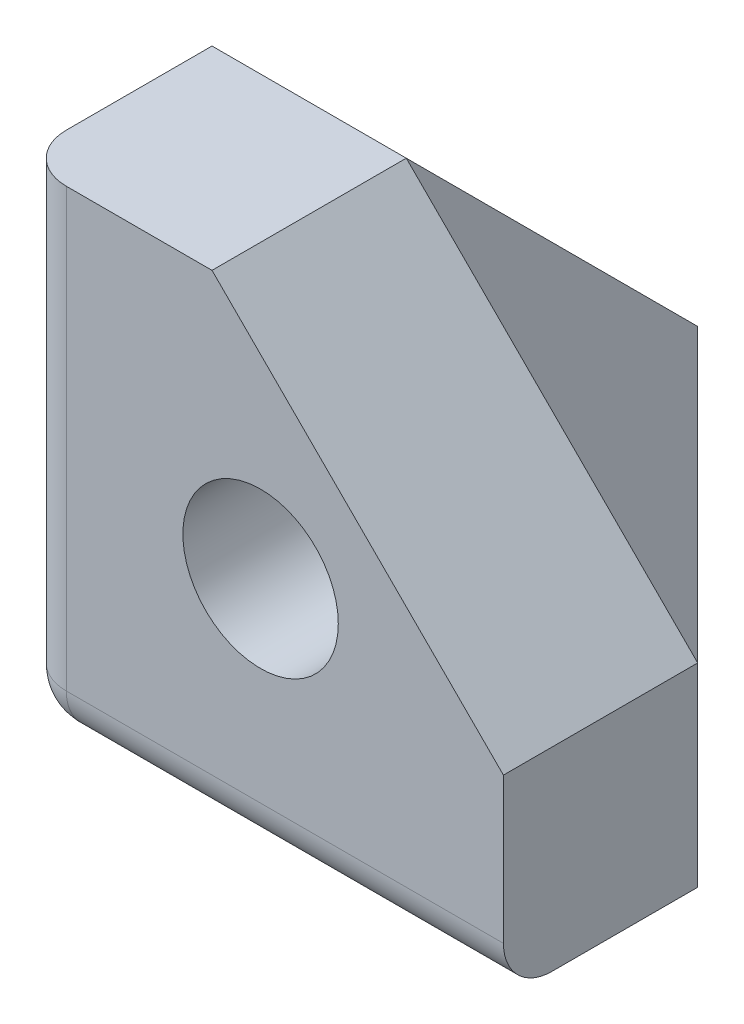
ISO-10303-21;
HEADER;
FILE_DESCRIPTION(('STEP AP214'),'2;1');
FILE_NAME('part.step','',(''),(''),'','','');
FILE_SCHEMA(('AUTOMOTIVE_DESIGN { 1 0 10303 214 1 1 1 1 }'));
ENDSEC;
DATA;
#1=APPLICATION_CONTEXT('core data for automotive mechanical design processes');
#2=APPLICATION_PROTOCOL_DEFINITION('international standard','automotive_design',2000,#1);
#3=PRODUCT_CONTEXT('',#1,'mechanical');
#4=PRODUCT('Part','Part','',(#3));
#5=PRODUCT_RELATED_PRODUCT_CATEGORY('part','',(#4));
#6=PRODUCT_DEFINITION_FORMATION('','',#4);
#7=PRODUCT_DEFINITION_CONTEXT('part definition',#1,'design');
#8=PRODUCT_DEFINITION('design','',#6,#7);
#9=PRODUCT_DEFINITION_SHAPE('','',#8);
#10=(LENGTH_UNIT() NAMED_UNIT(*) SI_UNIT(.MILLI.,.METRE.));
#11=(NAMED_UNIT(*) PLANE_ANGLE_UNIT() SI_UNIT($,.RADIAN.));
#12=(NAMED_UNIT(*) SI_UNIT($,.STERADIAN.) SOLID_ANGLE_UNIT());
#13=UNCERTAINTY_MEASURE_WITH_UNIT(LENGTH_MEASURE(1.E-05),#10,'distance_accuracy_value','');
#14=(GEOMETRIC_REPRESENTATION_CONTEXT(3) GLOBAL_UNCERTAINTY_ASSIGNED_CONTEXT((#13)) GLOBAL_UNIT_ASSIGNED_CONTEXT((#10,
#11,#12)) REPRESENTATION_CONTEXT('',''));
#15=CARTESIAN_POINT('',(0.,0.,0.));
#16=DIRECTION('',(0.,0.,1.));
#17=DIRECTION('',(1.,0.,0.));
#18=AXIS2_PLACEMENT_3D('',#15,#16,#17);
#19=CARTESIAN_POINT('',(5.,10.,5.));
#20=DIRECTION('',(-1.,0.,0.));
#21=DIRECTION('',(0.,0.,1.));
#22=AXIS2_PLACEMENT_3D('',#19,#20,#21);
#23=PLANE('',#22);
#24=DIRECTION('',(0.,0.,-1.));
#25=VECTOR('',#24,1.);
#26=CARTESIAN_POINT('',(5.,0.,5.));
#27=LINE('',#26,#25);
#28=CARTESIAN_POINT('',(5.,0.,4.));
#29=VERTEX_POINT('',#28);
#30=CARTESIAN_POINT('',(5.,0.,1.));
#31=VERTEX_POINT('',#30);
#32=EDGE_CURVE('E194',#29,#31,#27,.T.);
#33=ORIENTED_EDGE('',*,*,#32,.T.);
#34=DIRECTION('',(0.,1.,0.));
#35=VECTOR('',#34,1.);
#36=CARTESIAN_POINT('',(5.,10.,1.));
#37=LINE('',#36,#35);
#38=CARTESIAN_POINT('',(5.,3.99999999999998,1.));
#39=VERTEX_POINT('',#38);
#40=EDGE_CURVE('E159',#31,#39,#37,.T.);
#41=ORIENTED_EDGE('',*,*,#40,.T.);
#42=DIRECTION('',(0.,0.,1.));
#43=VECTOR('',#42,1.);
#44=CARTESIAN_POINT('',(5.,3.99999999999998,5.));
#45=LINE('',#44,#43);
#46=CARTESIAN_POINT('',(5.,3.99999999999998,5.));
#47=VERTEX_POINT('',#46);
#48=EDGE_CURVE('E156',#39,#47,#45,.T.);
#49=ORIENTED_EDGE('',*,*,#48,.T.);
#50=DIRECTION('',(0.,-1.,0.));
#51=VECTOR('',#50,1.);
#52=CARTESIAN_POINT('',(5.,10.,5.));
#53=LINE('',#52,#51);
#54=CARTESIAN_POINT('',(5.,0.999999999999999,5.));
#55=VERTEX_POINT('',#54);
#56=EDGE_CURVE('E203',#47,#55,#53,.T.);
#57=ORIENTED_EDGE('',*,*,#56,.T.);
#58=CARTESIAN_POINT('',(5.,0.999999999999999,4.));
#59=DIRECTION('',(-1.,0.,0.));
#60=DIRECTION('',(0.,0.,1.));
#61=AXIS2_PLACEMENT_3D('',#58,#59,#60);
#62=CIRCLE('',#61,1.);
#63=EDGE_CURVE('E131',#55,#29,#62,.F.);
#64=ORIENTED_EDGE('',*,*,#63,.T.);
#65=EDGE_LOOP('',(#33,#41,#49,#57,#64));
#66=FACE_BOUND('',#65,.T.);
#67=ADVANCED_FACE('F39',(#66),#23,.F.);
#68=CARTESIAN_POINT('',(-5.,10.,-5.));
#69=DIRECTION('',(0.,0.,1.));
#70=DIRECTION('',(1.,0.,0.));
#71=AXIS2_PLACEMENT_3D('',#68,#69,#70);
#72=PLANE('',#71);
#73=DIRECTION('',(1.,0.,0.));
#74=VECTOR('',#73,1.);
#75=CARTESIAN_POINT('',(-5.,3.99999999999998,-5.));
#76=LINE('',#75,#74);
#77=CARTESIAN_POINT('',(-5.,3.99999999999998,-5.));
#78=VERTEX_POINT('',#77);
#79=CARTESIAN_POINT('',(-1.00000000000002,3.99999999999998,-5.));
#80=VERTEX_POINT('',#79);
#81=EDGE_CURVE('E140',#78,#80,#76,.T.);
#82=ORIENTED_EDGE('',*,*,#81,.T.);
#83=DIRECTION('',(0.,-1.,0.));
#84=VECTOR('',#83,1.);
#85=CARTESIAN_POINT('',(-1.00000000000002,10.,-5.));
#86=LINE('',#85,#84);
#87=CARTESIAN_POINT('',(-1.00000000000002,0.,-5.));
#88=VERTEX_POINT('',#87);
#89=EDGE_CURVE('E152',#80,#88,#86,.T.);
#90=ORIENTED_EDGE('',*,*,#89,.T.);
#91=DIRECTION('',(-1.,0.,0.));
#92=VECTOR('',#91,1.);
#93=CARTESIAN_POINT('',(-5.,0.,-5.));
#94=LINE('',#93,#92);
#95=CARTESIAN_POINT('',(-4.,0.,-5.));
#96=VERTEX_POINT('',#95);
#97=EDGE_CURVE('E119',#88,#96,#94,.T.);
#98=ORIENTED_EDGE('',*,*,#97,.T.);
#99=CARTESIAN_POINT('',(-4.,0.999999999999999,-5.));
#100=DIRECTION('',(0.,0.,1.));
#101=DIRECTION('',(1.,0.,0.));
#102=AXIS2_PLACEMENT_3D('',#99,#100,#101);
#103=CIRCLE('',#102,1.);
#104=CARTESIAN_POINT('',(-5.,0.999999999999999,-5.));
#105=VERTEX_POINT('',#104);
#106=EDGE_CURVE('E206',#96,#105,#103,.F.);
#107=ORIENTED_EDGE('',*,*,#106,.T.);
#108=DIRECTION('',(0.,-1.,0.));
#109=VECTOR('',#108,1.);
#110=CARTESIAN_POINT('',(-5.,10.,-5.));
#111=LINE('',#110,#109);
#112=EDGE_CURVE('E129',#78,#105,#111,.T.);
#113=ORIENTED_EDGE('',*,*,#112,.F.);
#114=EDGE_LOOP('',(#82,#90,#98,#107,#113));
#115=FACE_BOUND('',#114,.T.);
#116=ADVANCED_FACE('F182',(#115),#72,.F.);
#117=CARTESIAN_POINT('',(-5.,10.,5.));
#118=DIRECTION('',(1.,0.,0.));
#119=DIRECTION('',(0.,0.,-1.));
#120=AXIS2_PLACEMENT_3D('',#117,#118,#119);
#121=PLANE('',#120);
#122=CARTESIAN_POINT('',(-5.,5.,0.));
#123=DIRECTION('',(1.,0.,0.));
#124=DIRECTION('',(0.,0.,-1.));
#125=AXIS2_PLACEMENT_3D('',#122,#123,#124);
#126=CIRCLE('',#125,1.6);
#127=CARTESIAN_POINT('',(-5.,5.,-1.6));
#128=VERTEX_POINT('',#127);
#129=EDGE_CURVE('E153',#128,#128,#126,.T.);
#130=ORIENTED_EDGE('',*,*,#129,.T.);
#131=EDGE_LOOP('',(#130));
#132=FACE_BOUND('',#131,.T.);
#133=DIRECTION('',(0.,0.,1.));
#134=VECTOR('',#133,1.);
#135=CARTESIAN_POINT('',(-5.,10.,5.));
#136=LINE('',#135,#134);
#137=CARTESIAN_POINT('',(-5.,10.,1.));
#138=VERTEX_POINT('',#137);
#139=CARTESIAN_POINT('',(-5.,10.,4.));
#140=VERTEX_POINT('',#139);
#141=EDGE_CURVE('E111',#138,#140,#136,.T.);
#142=ORIENTED_EDGE('',*,*,#141,.F.);
#143=DIRECTION('',(0.,0.707106781186549,0.707106781186546));
#144=VECTOR('',#143,1.);
#145=CARTESIAN_POINT('',(-5.,10.,1.));
#146=LINE('',#145,#144);
#147=EDGE_CURVE('E11',#138,#78,#146,.F.);
#148=ORIENTED_EDGE('',*,*,#147,.T.);
#149=ORIENTED_EDGE('',*,*,#112,.T.);
#150=DIRECTION('',(0.,0.,1.));
#151=VECTOR('',#150,1.);
#152=CARTESIAN_POINT('',(-5.,0.999999999999999,5.));
#153=LINE('',#152,#151);
#154=CARTESIAN_POINT('',(-5.,0.999999999999999,4.));
#155=VERTEX_POINT('',#154);
#156=EDGE_CURVE('E130',#105,#155,#153,.T.);
#157=ORIENTED_EDGE('',*,*,#156,.T.);
#158=DIRECTION('',(0.,-1.,0.));
#159=VECTOR('',#158,1.);
#160=CARTESIAN_POINT('',(-5.,10.,4.));
#161=LINE('',#160,#159);
#162=EDGE_CURVE('E121',#155,#140,#161,.F.);
#163=ORIENTED_EDGE('',*,*,#162,.T.);
#164=EDGE_LOOP('',(#142,#148,#149,#157,#163));
#165=FACE_BOUND('',#164,.T.);
#166=ADVANCED_FACE('F123',(#132,#165),#121,.F.);
#167=CARTESIAN_POINT('',(-5.,10.,5.));
#168=DIRECTION('',(0.,0.,-1.));
#169=DIRECTION('',(-1.,0.,0.));
#170=AXIS2_PLACEMENT_3D('',#167,#168,#169);
#171=PLANE('',#170);
#172=CARTESIAN_POINT('',(0.,5.,5.));
#173=DIRECTION('',(0.,0.,1.));
#174=DIRECTION('',(1.,0.,0.));
#175=AXIS2_PLACEMENT_3D('',#172,#173,#174);
#176=CIRCLE('',#175,1.6);
#177=CARTESIAN_POINT('',(1.6,5.,5.));
#178=VERTEX_POINT('',#177);
#179=EDGE_CURVE('E286',#178,#178,#176,.T.);
#180=ORIENTED_EDGE('',*,*,#179,.F.);
#181=EDGE_LOOP('',(#180));
#182=FACE_BOUND('',#181,.T.);
#183=ORIENTED_EDGE('',*,*,#56,.F.);
#184=DIRECTION('',(0.707106781186546,-0.707106781186549,0.));
#185=VECTOR('',#184,1.);
#186=CARTESIAN_POINT('',(-1.,10.,5.));
#187=LINE('',#186,#185);
#188=CARTESIAN_POINT('',(-1.,10.,5.));
#189=VERTEX_POINT('',#188);
#190=EDGE_CURVE('E47',#47,#189,#187,.F.);
#191=ORIENTED_EDGE('',*,*,#190,.T.);
#192=DIRECTION('',(1.,0.,0.));
#193=VECTOR('',#192,1.);
#194=CARTESIAN_POINT('',(-5.,10.,5.));
#195=LINE('',#194,#193);
#196=CARTESIAN_POINT('',(-4.,10.,5.));
#197=VERTEX_POINT('',#196);
#198=EDGE_CURVE('E118',#197,#189,#195,.T.);
#199=ORIENTED_EDGE('',*,*,#198,.F.);
#200=DIRECTION('',(0.,-1.,0.));
#201=VECTOR('',#200,1.);
#202=CARTESIAN_POINT('',(-4.,10.,5.));
#203=LINE('',#202,#201);
#204=CARTESIAN_POINT('',(-4.,0.999999999999999,5.));
#205=VERTEX_POINT('',#204);
#206=EDGE_CURVE('E135',#197,#205,#203,.T.);
#207=ORIENTED_EDGE('',*,*,#206,.T.);
#208=DIRECTION('',(1.,0.,0.));
#209=VECTOR('',#208,1.);
#210=CARTESIAN_POINT('',(5.,0.999999999999999,5.));
#211=LINE('',#210,#209);
#212=EDGE_CURVE('E137',#205,#55,#211,.T.);
#213=ORIENTED_EDGE('',*,*,#212,.T.);
#214=EDGE_LOOP('',(#183,#191,#199,#207,#213));
#215=FACE_BOUND('',#214,.T.);
#216=ADVANCED_FACE('F215',(#182,#215),#171,.F.);
#217=CARTESIAN_POINT('',(0.,10.,0.));
#218=DIRECTION('',(0.,-1.,0.));
#219=DIRECTION('',(0.,0.,-1.));
#220=AXIS2_PLACEMENT_3D('',#217,#218,#219);
#221=PLANE('',#220);
#222=ORIENTED_EDGE('',*,*,#198,.T.);
#223=DIRECTION('',(0.,0.,-1.));
#224=VECTOR('',#223,1.);
#225=CARTESIAN_POINT('',(-1.,10.,0.));
#226=LINE('',#225,#224);
#227=CARTESIAN_POINT('',(-1.,10.,1.));
#228=VERTEX_POINT('',#227);
#229=EDGE_CURVE('E60',#189,#228,#226,.T.);
#230=ORIENTED_EDGE('',*,*,#229,.T.);
#231=DIRECTION('',(-1.,0.,0.));
#232=VECTOR('',#231,1.);
#233=CARTESIAN_POINT('',(0.,10.,1.));
#234=LINE('',#233,#232);
#235=EDGE_CURVE('E116',#228,#138,#234,.T.);
#236=ORIENTED_EDGE('',*,*,#235,.T.);
#237=ORIENTED_EDGE('',*,*,#141,.T.);
#238=CARTESIAN_POINT('',(-4.,10.,4.));
#239=DIRECTION('',(0.,-1.,0.));
#240=DIRECTION('',(0.,0.,-1.));
#241=AXIS2_PLACEMENT_3D('',#238,#239,#240);
#242=CIRCLE('',#241,1.);
#243=EDGE_CURVE('E114',#140,#197,#242,.F.);
#244=ORIENTED_EDGE('',*,*,#243,.T.);
#245=EDGE_LOOP('',(#222,#230,#236,#237,#244));
#246=FACE_BOUND('',#245,.T.);
#247=ADVANCED_FACE('F113',(#246),#221,.F.);
#248=CARTESIAN_POINT('',(0.,0.,0.));
#249=DIRECTION('',(0.,-1.,0.));
#250=DIRECTION('',(0.,0.,-1.));
#251=AXIS2_PLACEMENT_3D('',#248,#249,#250);
#252=PLANE('',#251);
#253=CARTESIAN_POINT('',(0.,0.,0.));
#254=DIRECTION('',(0.,-1.,0.));
#255=DIRECTION('',(0.,0.,-1.));
#256=AXIS2_PLACEMENT_3D('',#253,#254,#255);
#257=CIRCLE('',#256,1.6);
#258=CARTESIAN_POINT('',(0.,0.,-1.6));
#259=VERTEX_POINT('',#258);
#260=EDGE_CURVE('E278',#259,#259,#257,.T.);
#261=ORIENTED_EDGE('',*,*,#260,.F.);
#262=EDGE_LOOP('',(#261));
#263=FACE_BOUND('',#262,.T.);
#264=ORIENTED_EDGE('',*,*,#97,.F.);
#265=DIRECTION('',(-0.707106781186549,0.,-0.707106781186546));
#266=VECTOR('',#265,1.);
#267=CARTESIAN_POINT('',(1.99999999999999,0.,-2.));
#268=LINE('',#267,#266);
#269=EDGE_CURVE('E158',#88,#31,#268,.F.);
#270=ORIENTED_EDGE('',*,*,#269,.T.);
#271=ORIENTED_EDGE('',*,*,#32,.F.);
#272=DIRECTION('',(1.,0.,0.));
#273=VECTOR('',#272,1.);
#274=CARTESIAN_POINT('',(-5.,0.,4.));
#275=LINE('',#274,#273);
#276=CARTESIAN_POINT('',(-4.,0.,4.));
#277=VERTEX_POINT('',#276);
#278=EDGE_CURVE('E204',#29,#277,#275,.F.);
#279=ORIENTED_EDGE('',*,*,#278,.T.);
#280=DIRECTION('',(0.,0.,1.));
#281=VECTOR('',#280,1.);
#282=CARTESIAN_POINT('',(-4.,0.,-5.));
#283=LINE('',#282,#281);
#284=EDGE_CURVE('E192',#277,#96,#283,.F.);
#285=ORIENTED_EDGE('',*,*,#284,.T.);
#286=EDGE_LOOP('',(#264,#270,#271,#279,#285));
#287=FACE_BOUND('',#286,.T.);
#288=ADVANCED_FACE('F186',(#263,#287),#252,.T.);
#289=CARTESIAN_POINT('',(0.,5.,1.8));
#290=DIRECTION('',(0.,0.,1.));
#291=DIRECTION('',(1.,0.,0.));
#292=AXIS2_PLACEMENT_3D('',#289,#290,#291);
#293=CYLINDRICAL_SURFACE('',#292,1.6);
#294=CARTESIAN_POINT('',(0.,5.,1.8));
#295=DIRECTION('',(0.,0.,1.));
#296=DIRECTION('',(1.,0.,0.));
#297=AXIS2_PLACEMENT_3D('',#294,#295,#296);
#298=CIRCLE('',#297,1.6);
#299=CARTESIAN_POINT('',(1.6,5.,1.8));
#300=VERTEX_POINT('',#299);
#301=EDGE_CURVE('E199',#300,#300,#298,.T.);
#302=ORIENTED_EDGE('',*,*,#301,.F.);
#303=EDGE_LOOP('',(#302));
#304=FACE_BOUND('',#303,.T.);
#305=ORIENTED_EDGE('',*,*,#179,.T.);
#306=EDGE_LOOP('',(#305));
#307=FACE_BOUND('',#306,.T.);
#308=ADVANCED_FACE('F246',(#304,#307),#293,.F.);
#309=CARTESIAN_POINT('',(0.,5.,1.8));
#310=DIRECTION('',(0.,0.,1.));
#311=DIRECTION('',(1.,0.,0.));
#312=AXIS2_PLACEMENT_3D('',#309,#310,#311);
#313=PLANE('',#312);
#314=ORIENTED_EDGE('',*,*,#301,.T.);
#315=EDGE_LOOP('',(#314));
#316=FACE_BOUND('',#315,.T.);
#317=ADVANCED_FACE('F255',(#316),#313,.T.);
#318=CARTESIAN_POINT('',(0.,3.2,0.));
#319=DIRECTION('',(0.,-1.,0.));
#320=DIRECTION('',(0.,0.,-1.));
#321=AXIS2_PLACEMENT_3D('',#318,#319,#320);
#322=CYLINDRICAL_SURFACE('',#321,1.6);
#323=CARTESIAN_POINT('',(0.,3.2,0.));
#324=DIRECTION('',(0.,-1.,0.));
#325=DIRECTION('',(0.,0.,-1.));
#326=AXIS2_PLACEMENT_3D('',#323,#324,#325);
#327=CIRCLE('',#326,1.6);
#328=CARTESIAN_POINT('',(0.,3.2,-1.6));
#329=VERTEX_POINT('',#328);
#330=EDGE_CURVE('E284',#329,#329,#327,.T.);
#331=ORIENTED_EDGE('',*,*,#330,.F.);
#332=EDGE_LOOP('',(#331));
#333=FACE_BOUND('',#332,.T.);
#334=ORIENTED_EDGE('',*,*,#260,.T.);
#335=EDGE_LOOP('',(#334));
#336=FACE_BOUND('',#335,.T.);
#337=ADVANCED_FACE('F256',(#333,#336),#322,.F.);
#338=CARTESIAN_POINT('',(0.,3.2,0.));
#339=DIRECTION('',(0.,-1.,0.));
#340=DIRECTION('',(0.,0.,-1.));
#341=AXIS2_PLACEMENT_3D('',#338,#339,#340);
#342=PLANE('',#341);
#343=ORIENTED_EDGE('',*,*,#330,.T.);
#344=EDGE_LOOP('',(#343));
#345=FACE_BOUND('',#344,.T.);
#346=ADVANCED_FACE('F259',(#345),#342,.T.);
#347=CARTESIAN_POINT('',(-1.8,5.,0.));
#348=DIRECTION('',(-1.,0.,0.));
#349=DIRECTION('',(0.,0.,1.));
#350=AXIS2_PLACEMENT_3D('',#347,#348,#349);
#351=CYLINDRICAL_SURFACE('',#350,1.6);
#352=CARTESIAN_POINT('',(-1.8,5.,0.));
#353=DIRECTION('',(1.,0.,0.));
#354=DIRECTION('',(0.,0.,-1.));
#355=AXIS2_PLACEMENT_3D('',#352,#353,#354);
#356=CIRCLE('',#355,1.6);
#357=CARTESIAN_POINT('',(-1.8,5.,-1.6));
#358=VERTEX_POINT('',#357);
#359=EDGE_CURVE('E277',#358,#358,#356,.T.);
#360=ORIENTED_EDGE('',*,*,#359,.T.);
#361=EDGE_LOOP('',(#360));
#362=FACE_BOUND('',#361,.T.);
#363=ORIENTED_EDGE('',*,*,#129,.F.);
#364=EDGE_LOOP('',(#363));
#365=FACE_BOUND('',#364,.T.);
#366=ADVANCED_FACE('F265',(#362,#365),#351,.F.);
#367=CARTESIAN_POINT('',(-1.8,5.,0.));
#368=DIRECTION('',(1.,0.,0.));
#369=DIRECTION('',(0.,0.,-1.));
#370=AXIS2_PLACEMENT_3D('',#367,#368,#369);
#371=PLANE('',#370);
#372=ORIENTED_EDGE('',*,*,#359,.F.);
#373=EDGE_LOOP('',(#372));
#374=FACE_BOUND('',#373,.T.);
#375=ADVANCED_FACE('F266',(#374),#371,.F.);
#376=CARTESIAN_POINT('',(-4.,10.,4.));
#377=DIRECTION('',(0.,-1.,0.));
#378=DIRECTION('',(0.,0.,-1.));
#379=AXIS2_PLACEMENT_3D('',#376,#377,#378);
#380=CYLINDRICAL_SURFACE('',#379,1.);
#381=ORIENTED_EDGE('',*,*,#243,.F.);
#382=ORIENTED_EDGE('',*,*,#162,.F.);
#383=CARTESIAN_POINT('',(-4.,0.999999999999999,4.));
#384=DIRECTION('',(0.,-1.,0.));
#385=DIRECTION('',(0.,0.,-1.));
#386=AXIS2_PLACEMENT_3D('',#383,#384,#385);
#387=CIRCLE('',#386,1.);
#388=EDGE_CURVE('E147',#205,#155,#387,.T.);
#389=ORIENTED_EDGE('',*,*,#388,.F.);
#390=ORIENTED_EDGE('',*,*,#206,.F.);
#391=EDGE_LOOP('',(#381,#382,#389,#390));
#392=FACE_BOUND('',#391,.T.);
#393=ADVANCED_FACE('F132',(#392),#380,.T.);
#394=CARTESIAN_POINT('',(-5.,0.999999999999999,4.));
#395=DIRECTION('',(-1.,0.,0.));
#396=DIRECTION('',(0.,0.,1.));
#397=AXIS2_PLACEMENT_3D('',#394,#395,#396);
#398=CYLINDRICAL_SURFACE('',#397,1.);
#399=ORIENTED_EDGE('',*,*,#63,.F.);
#400=ORIENTED_EDGE('',*,*,#212,.F.);
#401=CARTESIAN_POINT('',(-4.,1.,4.));
#402=DIRECTION('',(-1.,0.,0.));
#403=DIRECTION('',(0.,0.,1.));
#404=AXIS2_PLACEMENT_3D('',#401,#402,#403);
#405=CIRCLE('',#404,1.);
#406=EDGE_CURVE('E143',#277,#205,#405,.T.);
#407=ORIENTED_EDGE('',*,*,#406,.F.);
#408=ORIENTED_EDGE('',*,*,#278,.F.);
#409=EDGE_LOOP('',(#399,#400,#407,#408));
#410=FACE_BOUND('',#409,.T.);
#411=ADVANCED_FACE('F218',(#410),#398,.T.);
#412=CARTESIAN_POINT('',(-4.,1.,4.));
#413=DIRECTION('',(0.,0.,1.));
#414=DIRECTION('',(0.,-1.,0.));
#415=AXIS2_PLACEMENT_3D('',#412,#413,#414);
#416=SPHERICAL_SURFACE('',#415,1.);
#417=ORIENTED_EDGE('',*,*,#406,.T.);
#418=ORIENTED_EDGE('',*,*,#388,.T.);
#419=CARTESIAN_POINT('',(-4.,0.999999999999999,4.));
#420=DIRECTION('',(0.,0.,1.));
#421=DIRECTION('',(1.,0.,0.));
#422=AXIS2_PLACEMENT_3D('',#419,#420,#421);
#423=CIRCLE('',#422,1.);
#424=EDGE_CURVE('E141',#277,#155,#423,.F.);
#425=ORIENTED_EDGE('',*,*,#424,.F.);
#426=EDGE_LOOP('',(#417,#418,#425));
#427=FACE_BOUND('',#426,.T.);
#428=ADVANCED_FACE('F225',(#427),#416,.T.);
#429=CARTESIAN_POINT('',(-4.,0.999999999999999,5.));
#430=DIRECTION('',(0.,0.,-1.));
#431=DIRECTION('',(-1.,0.,0.));
#432=AXIS2_PLACEMENT_3D('',#429,#430,#431);
#433=CYLINDRICAL_SURFACE('',#432,1.);
#434=ORIENTED_EDGE('',*,*,#106,.F.);
#435=ORIENTED_EDGE('',*,*,#284,.F.);
#436=ORIENTED_EDGE('',*,*,#424,.T.);
#437=ORIENTED_EDGE('',*,*,#156,.F.);
#438=EDGE_LOOP('',(#434,#435,#436,#437));
#439=FACE_BOUND('',#438,.T.);
#440=ADVANCED_FACE('F223',(#439),#433,.T.);
#441=CARTESIAN_POINT('',(-1.,10.,0.));
#442=DIRECTION('',(-0.707106781186549,-0.707106781186546,0.));
#443=DIRECTION('',(0.,0.,-1.));
#444=AXIS2_PLACEMENT_3D('',#441,#442,#443);
#445=PLANE('',#444);
#446=ORIENTED_EDGE('',*,*,#190,.F.);
#447=ORIENTED_EDGE('',*,*,#48,.F.);
#448=DIRECTION('',(-0.707106781186546,0.707106781186549,0.));
#449=VECTOR('',#448,1.);
#450=CARTESIAN_POINT('',(5.,3.99999999999998,1.));
#451=LINE('',#450,#449);
#452=EDGE_CURVE('E42',#228,#39,#451,.F.);
#453=ORIENTED_EDGE('',*,*,#452,.F.);
#454=ORIENTED_EDGE('',*,*,#229,.F.);
#455=EDGE_LOOP('',(#446,#447,#453,#454));
#456=FACE_BOUND('',#455,.T.);
#457=ADVANCED_FACE('F45',(#456),#445,.F.);
#458=CARTESIAN_POINT('',(0.,10.,1.));
#459=DIRECTION('',(0.,-0.707106781186546,0.707106781186549));
#460=DIRECTION('',(-1.,0.,0.));
#461=AXIS2_PLACEMENT_3D('',#458,#459,#460);
#462=PLANE('',#461);
#463=ORIENTED_EDGE('',*,*,#147,.F.);
#464=ORIENTED_EDGE('',*,*,#235,.F.);
#465=DIRECTION('',(0.,-0.707106781186549,-0.707106781186546));
#466=VECTOR('',#465,1.);
#467=CARTESIAN_POINT('',(-1.00000000000001,6.99999999999999,-2.));
#468=LINE('',#467,#466);
#469=EDGE_CURVE('E170',#80,#228,#468,.F.);
#470=ORIENTED_EDGE('',*,*,#469,.F.);
#471=ORIENTED_EDGE('',*,*,#81,.F.);
#472=EDGE_LOOP('',(#463,#464,#470,#471));
#473=FACE_BOUND('',#472,.T.);
#474=ADVANCED_FACE('F295',(#473),#462,.F.);
#475=CARTESIAN_POINT('',(5.,3.99999999999998,1.));
#476=DIRECTION('',(0.577350269189626,0.577350269189624,-0.577350269189628));
#477=DIRECTION('',(-0.707106781186549,0.,-0.707106781186546));
#478=AXIS2_PLACEMENT_3D('',#475,#476,#477);
#479=PLANE('',#478);
#480=ORIENTED_EDGE('',*,*,#469,.T.);
#481=ORIENTED_EDGE('',*,*,#452,.T.);
#482=DIRECTION('',(0.707106781186549,0.,0.707106781186546));
#483=VECTOR('',#482,1.);
#484=CARTESIAN_POINT('',(5.,3.99999999999998,1.));
#485=LINE('',#484,#483);
#486=EDGE_CURVE('E164',#80,#39,#485,.T.);
#487=ORIENTED_EDGE('',*,*,#486,.F.);
#488=EDGE_LOOP('',(#480,#481,#487));
#489=FACE_BOUND('',#488,.T.);
#490=ADVANCED_FACE('F172',(#489),#479,.T.);
#491=CARTESIAN_POINT('',(-1.00000000000002,10.,-5.));
#492=DIRECTION('',(-0.707106781186546,0.,0.707106781186549));
#493=DIRECTION('',(0.,-1.,0.));
#494=AXIS2_PLACEMENT_3D('',#491,#492,#493);
#495=PLANE('',#494);
#496=ORIENTED_EDGE('',*,*,#486,.T.);
#497=ORIENTED_EDGE('',*,*,#40,.F.);
#498=ORIENTED_EDGE('',*,*,#269,.F.);
#499=ORIENTED_EDGE('',*,*,#89,.F.);
#500=EDGE_LOOP('',(#496,#497,#498,#499));
#501=FACE_BOUND('',#500,.T.);
#502=ADVANCED_FACE('F179',(#501),#495,.F.);
#503=CLOSED_SHELL('',(#67,#116,#166,#216,#247,#288,#308,#317,#337,#346,#366,#375,#393,#411,#428,
#440,#457,#474,#490,#502));
#504=MANIFOLD_SOLID_BREP('B2',#503);
#505=ADVANCED_BREP_SHAPE_REPRESENTATION('',(#18,#504),#14);
#506=SHAPE_DEFINITION_REPRESENTATION(#9,#505);
ENDSEC;
END-ISO-10303-21;
